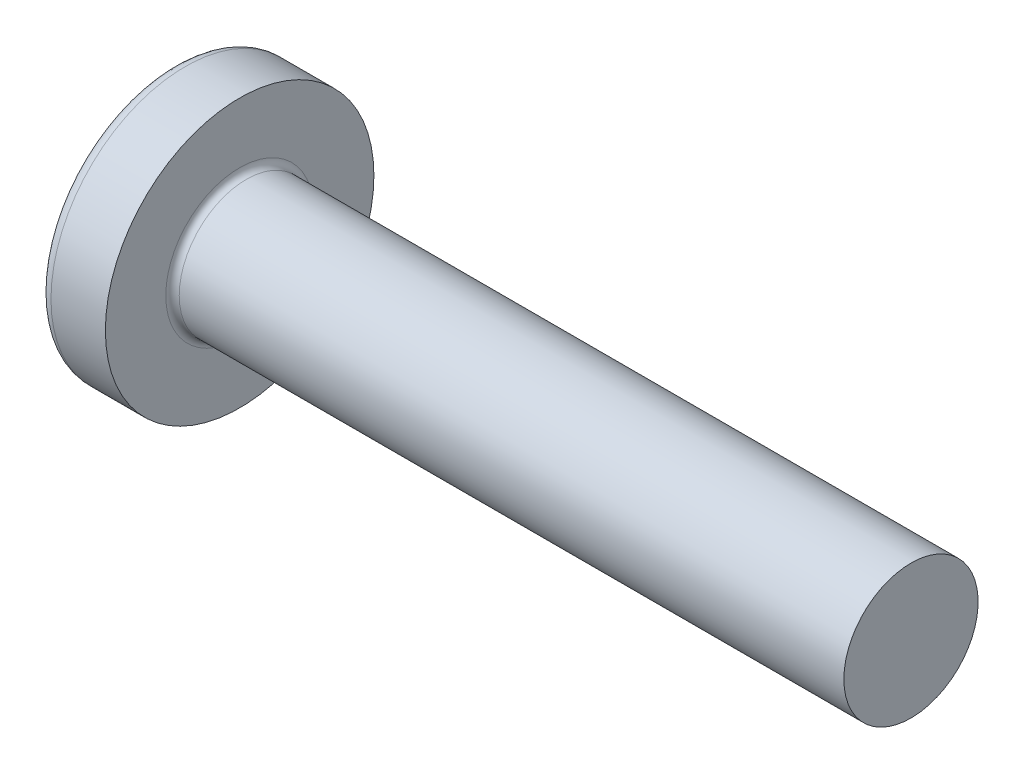
ISO-10303-21;
HEADER;
FILE_DESCRIPTION(('STEP AP214'),'2;1');
FILE_NAME('part.step','',(''),(''),'','','');
FILE_SCHEMA(('AUTOMOTIVE_DESIGN { 1 0 10303 214 1 1 1 1 }'));
ENDSEC;
DATA;
#1=APPLICATION_CONTEXT('core data for automotive mechanical design processes');
#2=APPLICATION_PROTOCOL_DEFINITION('international standard','automotive_design',2000,#1);
#3=PRODUCT_CONTEXT('',#1,'mechanical');
#4=PRODUCT('Part','Part','',(#3));
#5=PRODUCT_RELATED_PRODUCT_CATEGORY('part','',(#4));
#6=PRODUCT_DEFINITION_FORMATION('','',#4);
#7=PRODUCT_DEFINITION_CONTEXT('part definition',#1,'design');
#8=PRODUCT_DEFINITION('design','',#6,#7);
#9=PRODUCT_DEFINITION_SHAPE('','',#8);
#10=(LENGTH_UNIT() NAMED_UNIT(*) SI_UNIT(.MILLI.,.METRE.));
#11=(NAMED_UNIT(*) PLANE_ANGLE_UNIT() SI_UNIT($,.RADIAN.));
#12=(NAMED_UNIT(*) SI_UNIT($,.STERADIAN.) SOLID_ANGLE_UNIT());
#13=UNCERTAINTY_MEASURE_WITH_UNIT(LENGTH_MEASURE(1.E-05),#10,'distance_accuracy_value','');
#14=(GEOMETRIC_REPRESENTATION_CONTEXT(3) GLOBAL_UNCERTAINTY_ASSIGNED_CONTEXT((#13)) GLOBAL_UNIT_ASSIGNED_CONTEXT((#10,
#11,#12)) REPRESENTATION_CONTEXT('',''));
#15=CARTESIAN_POINT('',(0.,0.,0.));
#16=DIRECTION('',(0.,0.,1.));
#17=DIRECTION('',(1.,0.,0.));
#18=AXIS2_PLACEMENT_3D('',#15,#16,#17);
#19=CARTESIAN_POINT('',(3.2,0.,0.));
#20=DIRECTION('',(-1.,0.,0.));
#21=DIRECTION('',(0.,1.,0.));
#22=AXIS2_PLACEMENT_3D('',#19,#20,#21);
#23=SPHERICAL_SURFACE('',#22,3.2);
#24=CARTESIAN_POINT('',(0.646379599446113,0.,0.));
#25=DIRECTION('',(-1.,0.,0.));
#26=DIRECTION('',(0.,0.,1.));
#27=AXIS2_PLACEMENT_3D('',#24,#25,#26);
#28=CIRCLE('',#27,1.92847682119205);
#29=CARTESIAN_POINT('',(0.646379599446113,0.,1.92847682119205));
#30=VERTEX_POINT('',#29);
#31=EDGE_CURVE('E236',#30,#30,#28,.T.);
#32=ORIENTED_EDGE('',*,*,#31,.T.);
#33=EDGE_LOOP('',(#32));
#34=FACE_BOUND('',#33,.T.);
#35=CARTESIAN_POINT('',(0.0321614467928854,0.,0.));
#36=DIRECTION('',(1.,0.,0.));
#37=DIRECTION('',(0.,0.,-1.));
#38=AXIS2_PLACEMENT_3D('',#35,#36,#37);
#39=CIRCLE('',#38,0.452547125518057);
#40=CARTESIAN_POINT('',(0.0321614467928857,-0.239999999999998,-0.38366508938742));
#41=VERTEX_POINT('',#40);
#42=CARTESIAN_POINT('',(0.0321614467928854,-0.383665089387418,-0.24));
#43=VERTEX_POINT('',#42);
#44=EDGE_CURVE('E372',#41,#43,#39,.F.);
#45=ORIENTED_EDGE('',*,*,#44,.F.);
#46=CARTESIAN_POINT('',(3.2,-0.24,0.));
#47=DIRECTION('',(0.,1.,0.));
#48=DIRECTION('',(0.,0.,1.));
#49=AXIS2_PLACEMENT_3D('',#46,#47,#48);
#50=CIRCLE('',#49,3.19098730802866);
#51=CARTESIAN_POINT('',(0.160076670449441,-0.239999999999996,-0.970188718989376));
#52=VERTEX_POINT('',#51);
#53=EDGE_CURVE('E298',#52,#41,#50,.T.);
#54=ORIENTED_EDGE('',*,*,#53,.F.);
#55=CARTESIAN_POINT('',(2.98218770632418,0.,0.436863890831904));
#56=DIRECTION('',(0.446197800778958,0.,-0.89493436774996));
#57=DIRECTION('',(-0.89493436774996,0.,-0.446197800778958));
#58=AXIS2_PLACEMENT_3D('',#55,#56,#57);
#59=CIRCLE('',#58,3.16254766693103);
#60=CARTESIAN_POINT('',(0.160076670449441,0.240000000000003,-0.970188718989374));
#61=VERTEX_POINT('',#60);
#62=EDGE_CURVE('E270',#52,#61,#59,.T.);
#63=ORIENTED_EDGE('',*,*,#62,.T.);
#64=CARTESIAN_POINT('',(3.2,0.24,0.));
#65=DIRECTION('',(0.,-1.,0.));
#66=DIRECTION('',(0.,0.,-1.));
#67=AXIS2_PLACEMENT_3D('',#64,#65,#66);
#68=CIRCLE('',#67,3.19098730802866);
#69=CARTESIAN_POINT('',(0.0321614467928856,0.240000000000001,-0.383665089387418));
#70=VERTEX_POINT('',#69);
#71=EDGE_CURVE('E325',#70,#61,#68,.T.);
#72=ORIENTED_EDGE('',*,*,#71,.F.);
#73=CARTESIAN_POINT('',(0.0321614467928854,0.383665089387417,-0.24));
#74=VERTEX_POINT('',#73);
#75=EDGE_CURVE('E391',#74,#70,#39,.F.);
#76=ORIENTED_EDGE('',*,*,#75,.F.);
#77=CARTESIAN_POINT('',(3.2,0.,-0.24));
#78=DIRECTION('',(0.,0.,1.));
#79=DIRECTION('',(0.,-1.,0.));
#80=AXIS2_PLACEMENT_3D('',#77,#78,#79);
#81=CIRCLE('',#80,3.19098730802866);
#82=CARTESIAN_POINT('',(0.160076670449441,0.970188718989374,-0.24));
#83=VERTEX_POINT('',#82);
#84=EDGE_CURVE('E264',#83,#74,#81,.T.);
#85=ORIENTED_EDGE('',*,*,#84,.F.);
#86=CARTESIAN_POINT('',(2.98218770632418,-0.436863890831905,0.));
#87=DIRECTION('',(0.446197800778958,0.89493436774996,0.));
#88=DIRECTION('',(-0.89493436774996,0.446197800778958,0.));
#89=AXIS2_PLACEMENT_3D('',#86,#87,#88);
#90=CIRCLE('',#89,3.16254766693103);
#91=CARTESIAN_POINT('',(0.160076670449441,0.970188718989374,0.24));
#92=VERTEX_POINT('',#91);
#93=EDGE_CURVE('E267',#83,#92,#90,.T.);
#94=ORIENTED_EDGE('',*,*,#93,.T.);
#95=CARTESIAN_POINT('',(3.2,0.,0.24));
#96=DIRECTION('',(0.,0.,-1.));
#97=DIRECTION('',(-1.,0.,0.));
#98=AXIS2_PLACEMENT_3D('',#95,#96,#97);
#99=CIRCLE('',#98,3.19098730802866);
#100=CARTESIAN_POINT('',(0.0321614467928854,0.383665089387417,0.24));
#101=VERTEX_POINT('',#100);
#102=EDGE_CURVE('E260',#101,#92,#99,.T.);
#103=ORIENTED_EDGE('',*,*,#102,.F.);
#104=CARTESIAN_POINT('',(0.0321614467928857,0.239999999999999,0.38366508938742));
#105=VERTEX_POINT('',#104);
#106=EDGE_CURVE('E425',#105,#101,#39,.F.);
#107=ORIENTED_EDGE('',*,*,#106,.F.);
#108=CARTESIAN_POINT('',(0.160076670449441,0.239999999999997,0.970188718989375));
#109=VERTEX_POINT('',#108);
#110=EDGE_CURVE('E280',#109,#105,#68,.T.);
#111=ORIENTED_EDGE('',*,*,#110,.F.);
#112=CARTESIAN_POINT('',(2.98218770632418,0.,-0.436863890831904));
#113=DIRECTION('',(0.446197800778958,0.,0.89493436774996));
#114=DIRECTION('',(0.89493436774996,0.,-0.446197800778958));
#115=AXIS2_PLACEMENT_3D('',#112,#113,#114);
#116=CIRCLE('',#115,3.16254766693103);
#117=CARTESIAN_POINT('',(0.160076670449441,-0.240000000000004,0.970188718989374));
#118=VERTEX_POINT('',#117);
#119=EDGE_CURVE('E47',#109,#118,#116,.T.);
#120=ORIENTED_EDGE('',*,*,#119,.T.);
#121=CARTESIAN_POINT('',(0.0321614467928856,-0.240000000000001,0.383665089387418));
#122=VERTEX_POINT('',#121);
#123=EDGE_CURVE('E277',#122,#118,#50,.T.);
#124=ORIENTED_EDGE('',*,*,#123,.F.);
#125=CARTESIAN_POINT('',(0.0321614467928854,-0.383665089387418,0.24));
#126=VERTEX_POINT('',#125);
#127=EDGE_CURVE('E390',#126,#122,#39,.F.);
#128=ORIENTED_EDGE('',*,*,#127,.F.);
#129=CARTESIAN_POINT('',(0.160076670449441,-0.970188718989375,0.24));
#130=VERTEX_POINT('',#129);
#131=EDGE_CURVE('E261',#130,#126,#99,.T.);
#132=ORIENTED_EDGE('',*,*,#131,.F.);
#133=CARTESIAN_POINT('',(2.98218770632418,0.436863890831904,0.));
#134=DIRECTION('',(0.446197800778958,-0.89493436774996,0.));
#135=DIRECTION('',(0.89493436774996,0.446197800778958,0.));
#136=AXIS2_PLACEMENT_3D('',#133,#134,#135);
#137=CIRCLE('',#136,3.16254766693103);
#138=CARTESIAN_POINT('',(0.160076670449441,-0.970188718989375,-0.24));
#139=VERTEX_POINT('',#138);
#140=EDGE_CURVE('E257',#130,#139,#137,.T.);
#141=ORIENTED_EDGE('',*,*,#140,.T.);
#142=EDGE_CURVE('E62',#43,#139,#81,.T.);
#143=ORIENTED_EDGE('',*,*,#142,.F.);
#144=EDGE_LOOP('',(#45,#54,#63,#72,#76,#85,#94,#103,#107,#111,#120,#124,#128,#132,#141,#143));
#145=FACE_BOUND('',#144,.T.);
#146=ADVANCED_FACE('F34',(#34,#145),#23,.T.);
#147=CARTESIAN_POINT('',(1.42,0.342014140993248,-0.24));
#148=DIRECTION('',(0.,0.,1.));
#149=DIRECTION('',(0.,-1.,0.));
#150=AXIS2_PLACEMENT_3D('',#147,#148,#149);
#151=PLANE('',#150);
#152=ORIENTED_EDGE('',*,*,#84,.T.);
#153=CARTESIAN_POINT('',(-0.626811087646333,0.437068483432734,-0.24));
#154=CARTESIAN_POINT('',(-0.489788496188268,0.426133650699674,-0.24));
#155=CARTESIAN_POINT('',(-0.35277275089666,0.415111501640761,-0.24));
#156=CARTESIAN_POINT('',(-0.0787578829644779,0.392826208775377,-0.24));
#157=CARTESIAN_POINT('',(0.0582412392502162,0.381563059737591,-0.24));
#158=CARTESIAN_POINT('',(0.332213907654152,0.358729879929546,-0.24));
#159=CARTESIAN_POINT('',(0.469187453856034,0.347159849311357,-0.24));
#160=CARTESIAN_POINT('',(0.743097225439297,0.323608060039765,-0.24));
#161=CARTESIAN_POINT('',(0.880033451350377,0.311626307573655,-0.24));
#162=CARTESIAN_POINT('',(1.12503843743479,0.289667437089413,-0.24));
#163=CARTESIAN_POINT('',(1.23311691792,0.279799173776849,-0.24));
#164=CARTESIAN_POINT('',(1.4492267018282,0.259570129968442,-0.24));
#165=CARTESIAN_POINT('',(1.55725800577256,0.249209355061897,-0.24));
#166=CARTESIAN_POINT('',(1.77325939831777,0.227783788850472,-0.24));
#167=CARTESIAN_POINT('',(1.88122948205844,0.216718947894399,-0.24));
#168=CARTESIAN_POINT('',(2.04309848476113,0.199296215271932,-0.24));
#169=CARTESIAN_POINT('',(2.09704158415864,0.193350927204475,-0.24));
#170=CARTESIAN_POINT('',(2.20488609252136,0.181086542764125,-0.24));
#171=CARTESIAN_POINT('',(2.25878750075649,0.174767439988846,-0.24));
#172=CARTESIAN_POINT('',(2.31266102213859,0.168212174791089,-0.24));
#173=B_SPLINE_CURVE_WITH_KNOTS('',3,(#153,#154,#155,#156,#157,#158,#159,#160,#161,#162,#163,
#164,#165,#166,#167,#168,#169,#170,#171,#172),.UNSPECIFIED.,.F.,.F.,(4,2,2,2,2,2,2,2,2,4),(0.,
0.412374804430943,0.824758569256476,1.23714212973639,1.64951949568622,1.97510284899868,
2.30068250829037,2.62628515317116,2.78909323564388,2.95190410736571),.UNSPECIFIED.);
#174=CARTESIAN_POINT('',(1.42,0.262259890185289,-0.240000000000001));
#175=VERTEX_POINT('',#174);
#176=EDGE_CURVE('E412',#74,#175,#173,.T.);
#177=ORIENTED_EDGE('',*,*,#176,.T.);
#178=DIRECTION('',(0.,1.,0.));
#179=VECTOR('',#178,1.);
#180=CARTESIAN_POINT('',(1.42,-0.342014140993248,-0.24));
#181=LINE('',#180,#179);
#182=CARTESIAN_POINT('',(1.42,0.342014140993248,-0.24));
#183=VERTEX_POINT('',#182);
#184=EDGE_CURVE('E354',#175,#183,#181,.T.);
#185=ORIENTED_EDGE('',*,*,#184,.T.);
#186=DIRECTION('',(0.89493436774996,-0.446197800778958,0.));
#187=VECTOR('',#186,1.);
#188=CARTESIAN_POINT('',(0.,1.05,-0.24));
#189=LINE('',#188,#187);
#190=EDGE_CURVE('E237',#83,#183,#189,.T.);
#191=ORIENTED_EDGE('',*,*,#190,.F.);
#192=EDGE_LOOP('',(#152,#177,#185,#191));
#193=FACE_BOUND('',#192,.T.);
#194=ADVANCED_FACE('F192',(#193),#151,.T.);
#195=CARTESIAN_POINT('',(1.42,-0.342014140993248,-0.24));
#196=VERTEX_POINT('',#195);
#197=CARTESIAN_POINT('',(1.42,-0.262259890185289,-0.240000000000001));
#198=VERTEX_POINT('',#197);
#199=EDGE_CURVE('E245',#196,#198,#181,.T.);
#200=ORIENTED_EDGE('',*,*,#199,.T.);
#201=CARTESIAN_POINT('',(-0.626811087646333,-0.437068483432734,-0.24));
#202=CARTESIAN_POINT('',(-0.489788496188267,-0.426133650699674,-0.24));
#203=CARTESIAN_POINT('',(-0.35277275089666,-0.415111501640761,-0.24));
#204=CARTESIAN_POINT('',(-0.0787578829644778,-0.392826208775377,-0.24));
#205=CARTESIAN_POINT('',(0.0582412392502162,-0.381563059737591,-0.24));
#206=CARTESIAN_POINT('',(0.332213907654153,-0.358729879929546,-0.24));
#207=CARTESIAN_POINT('',(0.469187453856035,-0.347159849311357,-0.24));
#208=CARTESIAN_POINT('',(0.743097225439297,-0.323608060039765,-0.24));
#209=CARTESIAN_POINT('',(0.880033451350377,-0.311626307573655,-0.24));
#210=CARTESIAN_POINT('',(1.12503843743479,-0.289667437089413,-0.24));
#211=CARTESIAN_POINT('',(1.23311691792,-0.279799173776849,-0.24));
#212=CARTESIAN_POINT('',(1.4492267018282,-0.259570129968442,-0.24));
#213=CARTESIAN_POINT('',(1.55725800577256,-0.249209355061897,-0.24));
#214=CARTESIAN_POINT('',(1.77325939831777,-0.227783788850472,-0.24));
#215=CARTESIAN_POINT('',(1.88122948205844,-0.216718947894399,-0.24));
#216=CARTESIAN_POINT('',(2.04309848476113,-0.199296215271932,-0.24));
#217=CARTESIAN_POINT('',(2.09704158415864,-0.193350927204474,-0.24));
#218=CARTESIAN_POINT('',(2.20488609252136,-0.181086542764125,-0.24));
#219=CARTESIAN_POINT('',(2.25878750075649,-0.174767439988846,-0.24));
#220=CARTESIAN_POINT('',(2.31266102213859,-0.168212174791089,-0.24));
#221=B_SPLINE_CURVE_WITH_KNOTS('',3,(#201,#202,#203,#204,#205,#206,#207,#208,#209,#210,#211,
#212,#213,#214,#215,#216,#217,#218,#219,#220),.UNSPECIFIED.,.F.,.F.,(4,2,2,2,2,2,2,2,2,4),(0.,
0.412374804430943,0.824758569256476,1.23714212973639,1.64951949568622,1.97510284899868,
2.30068250829037,2.62628515317116,2.78909323564388,2.95190410736571),.UNSPECIFIED.);
#222=EDGE_CURVE('E389',#198,#43,#221,.F.);
#223=ORIENTED_EDGE('',*,*,#222,.T.);
#224=ORIENTED_EDGE('',*,*,#142,.T.);
#225=DIRECTION('',(0.89493436774996,0.446197800778958,0.));
#226=VECTOR('',#225,1.);
#227=CARTESIAN_POINT('',(0.,-1.05,-0.24));
#228=LINE('',#227,#226);
#229=EDGE_CURVE('E328',#139,#196,#228,.T.);
#230=ORIENTED_EDGE('',*,*,#229,.T.);
#231=EDGE_LOOP('',(#200,#223,#224,#230));
#232=FACE_BOUND('',#231,.T.);
#233=ADVANCED_FACE('F198',(#232),#151,.T.);
#234=CARTESIAN_POINT('',(1.42,-0.342014140993248,0.24));
#235=DIRECTION('',(0.,0.,-1.));
#236=DIRECTION('',(-1.,0.,0.));
#237=AXIS2_PLACEMENT_3D('',#234,#235,#236);
#238=PLANE('',#237);
#239=DIRECTION('',(0.,-1.,0.));
#240=VECTOR('',#239,1.);
#241=CARTESIAN_POINT('',(1.42,0.342014140993248,0.24));
#242=LINE('',#241,#240);
#243=CARTESIAN_POINT('',(1.42,0.342014140993248,0.24));
#244=VERTEX_POINT('',#243);
#245=CARTESIAN_POINT('',(1.42,0.262259890185289,0.240000000000001));
#246=VERTEX_POINT('',#245);
#247=EDGE_CURVE('E337',#244,#246,#242,.T.);
#248=ORIENTED_EDGE('',*,*,#247,.T.);
#249=CARTESIAN_POINT('',(-0.62681108769363,0.437068483436507,0.24));
#250=CARTESIAN_POINT('',(-0.489788496230297,0.426133650703048,0.24));
#251=CARTESIAN_POINT('',(-0.352772750933422,0.415111501643733,0.24));
#252=CARTESIAN_POINT('',(-0.0787578829907055,0.392826208777529,0.24));
#253=CARTESIAN_POINT('',(0.0582412392292552,0.381563059739326,0.24));
#254=CARTESIAN_POINT('',(0.332213907649304,0.358729879929962,0.24));
#255=CARTESIAN_POINT('',(0.46918745386203,0.347159849310859,0.24));
#256=CARTESIAN_POINT('',(0.743097225466975,0.323608060037368,0.24));
#257=CARTESIAN_POINT('',(0.880033451388893,0.311626307570274,0.24));
#258=CARTESIAN_POINT('',(1.12503843748414,0.289667437084935,0.24));
#259=CARTESIAN_POINT('',(1.23311691796934,0.279799173772307,0.24));
#260=CARTESIAN_POINT('',(1.44922670187753,0.259570129963748,0.24));
#261=CARTESIAN_POINT('',(1.55725800582188,0.249209355057115,0.24));
#262=CARTESIAN_POINT('',(1.77325939836707,0.227783788845471,0.24));
#263=CARTESIAN_POINT('',(1.88122948210773,0.216718947889267,0.24));
#264=CARTESIAN_POINT('',(2.0430984848104,0.199296215266543,0.24));
#265=CARTESIAN_POINT('',(2.0970415842079,0.193350927198989,0.24));
#266=CARTESIAN_POINT('',(2.20488609257059,0.181086542758414,0.24));
#267=CARTESIAN_POINT('',(2.25878750080571,0.174767439983005,0.24));
#268=CARTESIAN_POINT('',(2.31266102218779,0.168212174785095,0.24));
#269=B_SPLINE_CURVE_WITH_KNOTS('',3,(#249,#250,#251,#252,#253,#254,#255,#256,#257,#258,#259,
#260,#261,#262,#263,#264,#265,#266,#267,#268),.UNSPECIFIED.,.F.,.F.,(4,2,2,2,2,2,2,2,2,4),(0.,
0.412374804446791,0.824758569288173,1.23714212980074,1.64951949578321,1.97510284909568,
2.30068250838737,2.62628515326816,2.78909323574089,2.95190410746272),.UNSPECIFIED.);
#270=EDGE_CURVE('E426',#246,#101,#269,.F.);
#271=ORIENTED_EDGE('',*,*,#270,.T.);
#272=ORIENTED_EDGE('',*,*,#102,.T.);
#273=DIRECTION('',(0.89493436774996,-0.446197800778958,0.));
#274=VECTOR('',#273,1.);
#275=CARTESIAN_POINT('',(0.,1.05,0.24));
#276=LINE('',#275,#274);
#277=EDGE_CURVE('E242',#92,#244,#276,.T.);
#278=ORIENTED_EDGE('',*,*,#277,.T.);
#279=EDGE_LOOP('',(#248,#271,#272,#278));
#280=FACE_BOUND('',#279,.T.);
#281=ADVANCED_FACE('F408',(#280),#238,.T.);
#282=ORIENTED_EDGE('',*,*,#131,.T.);
#283=CARTESIAN_POINT('',(-0.62681108769363,-0.437068483436507,0.24));
#284=CARTESIAN_POINT('',(-0.489788496230297,-0.426133650703048,0.24));
#285=CARTESIAN_POINT('',(-0.352772750933422,-0.415111501643733,0.24));
#286=CARTESIAN_POINT('',(-0.0787578829907056,-0.392826208777529,0.24));
#287=CARTESIAN_POINT('',(0.0582412392292552,-0.381563059739326,0.24));
#288=CARTESIAN_POINT('',(0.332213907649304,-0.358729879929962,0.24));
#289=CARTESIAN_POINT('',(0.46918745386203,-0.347159849310859,0.24));
#290=CARTESIAN_POINT('',(0.743097225466975,-0.323608060037368,0.24));
#291=CARTESIAN_POINT('',(0.880033451388893,-0.311626307570274,0.24));
#292=CARTESIAN_POINT('',(1.12503843748414,-0.289667437084935,0.24));
#293=CARTESIAN_POINT('',(1.23311691796934,-0.279799173772307,0.24));
#294=CARTESIAN_POINT('',(1.44922670187753,-0.259570129963748,0.24));
#295=CARTESIAN_POINT('',(1.55725800582188,-0.249209355057115,0.24));
#296=CARTESIAN_POINT('',(1.77325939836707,-0.227783788845471,0.24));
#297=CARTESIAN_POINT('',(1.88122948210773,-0.216718947889267,0.24));
#298=CARTESIAN_POINT('',(2.0430984848104,-0.199296215266543,0.24));
#299=CARTESIAN_POINT('',(2.0970415842079,-0.193350927198989,0.24));
#300=CARTESIAN_POINT('',(2.20488609257059,-0.181086542758414,0.24));
#301=CARTESIAN_POINT('',(2.25878750080571,-0.174767439983005,0.24));
#302=CARTESIAN_POINT('',(2.31266102218779,-0.168212174785095,0.24));
#303=B_SPLINE_CURVE_WITH_KNOTS('',3,(#283,#284,#285,#286,#287,#288,#289,#290,#291,#292,#293,
#294,#295,#296,#297,#298,#299,#300,#301,#302),.UNSPECIFIED.,.F.,.F.,(4,2,2,2,2,2,2,2,2,4),(0.,
0.412374804446791,0.824758569288173,1.23714212980074,1.64951949578321,1.97510284909568,
2.30068250838736,2.62628515326816,2.78909323574088,2.95190410746272),.UNSPECIFIED.);
#304=CARTESIAN_POINT('',(1.42,-0.262259890185289,0.240000000000001));
#305=VERTEX_POINT('',#304);
#306=EDGE_CURVE('E445',#126,#305,#303,.T.);
#307=ORIENTED_EDGE('',*,*,#306,.T.);
#308=CARTESIAN_POINT('',(1.42,-0.342014140993248,0.24));
#309=VERTEX_POINT('',#308);
#310=EDGE_CURVE('E339',#305,#309,#242,.T.);
#311=ORIENTED_EDGE('',*,*,#310,.T.);
#312=DIRECTION('',(0.89493436774996,0.446197800778958,0.));
#313=VECTOR('',#312,1.);
#314=CARTESIAN_POINT('',(0.,-1.05,0.24));
#315=LINE('',#314,#313);
#316=EDGE_CURVE('E330',#130,#309,#315,.T.);
#317=ORIENTED_EDGE('',*,*,#316,.F.);
#318=EDGE_LOOP('',(#282,#307,#311,#317));
#319=FACE_BOUND('',#318,.T.);
#320=ADVANCED_FACE('F504',(#319),#238,.T.);
#321=CARTESIAN_POINT('',(1.42,0.342014140993248,0.24));
#322=DIRECTION('',(0.446197800778958,0.89493436774996,0.));
#323=DIRECTION('',(-0.89493436774996,0.446197800778958,0.));
#324=AXIS2_PLACEMENT_3D('',#321,#322,#323);
#325=PLANE('',#324);
#326=CARTESIAN_POINT('',(2.01772939130752,0.0439972701774458,0.));
#327=DIRECTION('',(0.446197800778958,0.89493436774996,0.));
#328=DIRECTION('',(-0.89493436774996,0.446197800778958,0.));
#329=AXIS2_PLACEMENT_3D('',#326,#327,#328);
#330=ELLIPSE('',#329,0.703057452800714,0.310602024247227);
#331=CARTESIAN_POINT('',(1.42,0.342014140993249,0.0969875113643501));
#332=VERTEX_POINT('',#331);
#333=CARTESIAN_POINT('',(1.42,0.342014140993249,-0.09698751136435));
#334=VERTEX_POINT('',#333);
#335=EDGE_CURVE('E303',#332,#334,#330,.F.);
#336=ORIENTED_EDGE('',*,*,#335,.F.);
#337=DIRECTION('',(0.,0.,-1.));
#338=VECTOR('',#337,1.);
#339=CARTESIAN_POINT('',(1.42,0.342014140993248,0.24));
#340=LINE('',#339,#338);
#341=EDGE_CURVE('E340',#244,#332,#340,.T.);
#342=ORIENTED_EDGE('',*,*,#341,.F.);
#343=ORIENTED_EDGE('',*,*,#277,.F.);
#344=ORIENTED_EDGE('',*,*,#93,.F.);
#345=ORIENTED_EDGE('',*,*,#190,.T.);
#346=EDGE_CURVE('E342',#334,#183,#340,.T.);
#347=ORIENTED_EDGE('',*,*,#346,.F.);
#348=EDGE_LOOP('',(#336,#342,#343,#344,#345,#347));
#349=FACE_BOUND('',#348,.T.);
#350=ADVANCED_FACE('F406',(#349),#325,.F.);
#351=CARTESIAN_POINT('',(1.42,-0.342014140993248,-0.24));
#352=DIRECTION('',(0.446197800778958,-0.89493436774996,0.));
#353=DIRECTION('',(0.89493436774996,0.446197800778958,0.));
#354=AXIS2_PLACEMENT_3D('',#351,#352,#353);
#355=PLANE('',#354);
#356=CARTESIAN_POINT('',(2.01772939130752,-0.0439972701774457,0.));
#357=DIRECTION('',(0.446197800778958,-0.89493436774996,0.));
#358=DIRECTION('',(-0.89493436774996,-0.446197800778958,0.));
#359=AXIS2_PLACEMENT_3D('',#356,#357,#358);
#360=ELLIPSE('',#359,0.703057452800713,0.310602024247227);
#361=CARTESIAN_POINT('',(1.42,-0.342014140993249,-0.09698751136435));
#362=VERTEX_POINT('',#361);
#363=CARTESIAN_POINT('',(1.42,-0.342014140993249,0.09698751136435));
#364=VERTEX_POINT('',#363);
#365=EDGE_CURVE('E450',#362,#364,#360,.F.);
#366=ORIENTED_EDGE('',*,*,#365,.F.);
#367=DIRECTION('',(0.,0.,1.));
#368=VECTOR('',#367,1.);
#369=CARTESIAN_POINT('',(1.42,-0.342014140993248,-0.24));
#370=LINE('',#369,#368);
#371=EDGE_CURVE('E333',#196,#362,#370,.T.);
#372=ORIENTED_EDGE('',*,*,#371,.F.);
#373=ORIENTED_EDGE('',*,*,#229,.F.);
#374=ORIENTED_EDGE('',*,*,#140,.F.);
#375=ORIENTED_EDGE('',*,*,#316,.T.);
#376=EDGE_CURVE('E336',#364,#309,#370,.T.);
#377=ORIENTED_EDGE('',*,*,#376,.F.);
#378=EDGE_LOOP('',(#366,#372,#373,#374,#375,#377));
#379=FACE_BOUND('',#378,.T.);
#380=ADVANCED_FACE('F498',(#379),#355,.F.);
#381=CARTESIAN_POINT('',(1.42,-0.342014140993248,-0.24));
#382=DIRECTION('',(1.,0.,0.));
#383=DIRECTION('',(0.,0.,-1.));
#384=AXIS2_PLACEMENT_3D('',#381,#382,#383);
#385=PLANE('',#384);
#386=CARTESIAN_POINT('',(1.42,0.,0.));
#387=DIRECTION('',(-1.,0.,0.));
#388=DIRECTION('',(0.,0.,1.));
#389=AXIS2_PLACEMENT_3D('',#386,#387,#388);
#390=CIRCLE('',#389,0.3555);
#391=CARTESIAN_POINT('',(1.42,-0.096987511364352,-0.342014140993249));
#392=VERTEX_POINT('',#391);
#393=CARTESIAN_POINT('',(1.42,-0.239999999999999,-0.262259890185289));
#394=VERTEX_POINT('',#393);
#395=EDGE_CURVE('E54',#392,#394,#390,.T.);
#396=ORIENTED_EDGE('',*,*,#395,.F.);
#397=DIRECTION('',(0.,-1.,0.));
#398=VECTOR('',#397,1.);
#399=CARTESIAN_POINT('',(1.42,0.240000000000001,-0.342014140993247));
#400=LINE('',#399,#398);
#401=CARTESIAN_POINT('',(1.42,-0.239999999999999,-0.342014140993249));
#402=VERTEX_POINT('',#401);
#403=EDGE_CURVE('E313',#392,#402,#400,.T.);
#404=ORIENTED_EDGE('',*,*,#403,.T.);
#405=DIRECTION('',(0.,0.,-1.));
#406=VECTOR('',#405,1.);
#407=CARTESIAN_POINT('',(1.42,-0.240000000000001,0.342014140993247));
#408=LINE('',#407,#406);
#409=EDGE_CURVE('E317',#394,#402,#408,.T.);
#410=ORIENTED_EDGE('',*,*,#409,.F.);
#411=EDGE_LOOP('',(#396,#404,#410));
#412=FACE_BOUND('',#411,.T.);
#413=ADVANCED_FACE('F378',(#412),#385,.F.);
#414=EDGE_CURVE('E383',#198,#362,#390,.T.);
#415=ORIENTED_EDGE('',*,*,#414,.F.);
#416=ORIENTED_EDGE('',*,*,#199,.F.);
#417=ORIENTED_EDGE('',*,*,#371,.T.);
#418=EDGE_LOOP('',(#415,#416,#417));
#419=FACE_BOUND('',#418,.T.);
#420=ADVANCED_FACE('F497',(#419),#385,.F.);
#421=EDGE_CURVE('E511',#364,#305,#390,.T.);
#422=ORIENTED_EDGE('',*,*,#421,.F.);
#423=ORIENTED_EDGE('',*,*,#376,.T.);
#424=ORIENTED_EDGE('',*,*,#310,.F.);
#425=EDGE_LOOP('',(#422,#423,#424));
#426=FACE_BOUND('',#425,.T.);
#427=ADVANCED_FACE('F495',(#426),#385,.F.);
#428=CARTESIAN_POINT('',(1.42,-0.240000000000001,0.262259890185289));
#429=VERTEX_POINT('',#428);
#430=CARTESIAN_POINT('',(1.42,-0.0969875113643545,0.342014140993248));
#431=VERTEX_POINT('',#430);
#432=EDGE_CURVE('E482',#429,#431,#390,.T.);
#433=ORIENTED_EDGE('',*,*,#432,.F.);
#434=CARTESIAN_POINT('',(1.42,-0.240000000000001,0.342014140993247));
#435=VERTEX_POINT('',#434);
#436=EDGE_CURVE('E314',#435,#429,#408,.T.);
#437=ORIENTED_EDGE('',*,*,#436,.F.);
#438=DIRECTION('',(0.,1.,0.));
#439=VECTOR('',#438,1.);
#440=CARTESIAN_POINT('',(1.42,-0.240000000000001,0.342014140993247));
#441=LINE('',#440,#439);
#442=EDGE_CURVE('E318',#435,#431,#441,.T.);
#443=ORIENTED_EDGE('',*,*,#442,.T.);
#444=EDGE_LOOP('',(#433,#437,#443));
#445=FACE_BOUND('',#444,.T.);
#446=ADVANCED_FACE('F480',(#445),#385,.F.);
#447=CARTESIAN_POINT('',(1.42,0.096987511364352,0.342014140993249));
#448=VERTEX_POINT('',#447);
#449=CARTESIAN_POINT('',(1.42,0.239999999999999,0.26225989018529));
#450=VERTEX_POINT('',#449);
#451=EDGE_CURVE('E384',#448,#450,#390,.T.);
#452=ORIENTED_EDGE('',*,*,#451,.F.);
#453=CARTESIAN_POINT('',(1.42,0.239999999999999,0.342014140993249));
#454=VERTEX_POINT('',#453);
#455=EDGE_CURVE('E321',#448,#454,#441,.T.);
#456=ORIENTED_EDGE('',*,*,#455,.T.);
#457=DIRECTION('',(0.,0.,1.));
#458=VECTOR('',#457,1.);
#459=CARTESIAN_POINT('',(1.42,0.240000000000001,-0.342014140993247));
#460=LINE('',#459,#458);
#461=EDGE_CURVE('E295',#450,#454,#460,.T.);
#462=ORIENTED_EDGE('',*,*,#461,.F.);
#463=EDGE_LOOP('',(#452,#456,#462));
#464=FACE_BOUND('',#463,.T.);
#465=ADVANCED_FACE('F488',(#464),#385,.F.);
#466=EDGE_CURVE('E464',#246,#332,#390,.T.);
#467=ORIENTED_EDGE('',*,*,#466,.F.);
#468=ORIENTED_EDGE('',*,*,#247,.F.);
#469=ORIENTED_EDGE('',*,*,#341,.T.);
#470=EDGE_LOOP('',(#467,#468,#469));
#471=FACE_BOUND('',#470,.T.);
#472=ADVANCED_FACE('F490',(#471),#385,.F.);
#473=EDGE_CURVE('E462',#334,#175,#390,.T.);
#474=ORIENTED_EDGE('',*,*,#473,.F.);
#475=ORIENTED_EDGE('',*,*,#346,.T.);
#476=ORIENTED_EDGE('',*,*,#184,.F.);
#477=EDGE_LOOP('',(#474,#475,#476));
#478=FACE_BOUND('',#477,.T.);
#479=ADVANCED_FACE('F465',(#478),#385,.F.);
#480=CARTESIAN_POINT('',(1.42,0.240000000000001,-0.262259890185289));
#481=VERTEX_POINT('',#480);
#482=CARTESIAN_POINT('',(1.42,0.0969875113643544,-0.342014140993248));
#483=VERTEX_POINT('',#482);
#484=EDGE_CURVE('E382',#481,#483,#390,.T.);
#485=ORIENTED_EDGE('',*,*,#484,.F.);
#486=CARTESIAN_POINT('',(1.42,0.240000000000001,-0.342014140993247));
#487=VERTEX_POINT('',#486);
#488=EDGE_CURVE('E322',#487,#481,#460,.T.);
#489=ORIENTED_EDGE('',*,*,#488,.F.);
#490=EDGE_CURVE('E310',#487,#483,#400,.T.);
#491=ORIENTED_EDGE('',*,*,#490,.T.);
#492=EDGE_LOOP('',(#485,#489,#491));
#493=FACE_BOUND('',#492,.T.);
#494=ADVANCED_FACE('F436',(#493),#385,.F.);
#495=CARTESIAN_POINT('',(1.42,-0.239999999999999,-0.342014140993249));
#496=DIRECTION('',(0.,1.,0.));
#497=DIRECTION('',(-1.,0.,0.));
#498=AXIS2_PLACEMENT_3D('',#495,#496,#497);
#499=PLANE('',#498);
#500=ORIENTED_EDGE('',*,*,#436,.T.);
#501=CARTESIAN_POINT('',(-0.62681108769363,-0.240000000000001,0.437068483436506));
#502=CARTESIAN_POINT('',(-0.489788496230297,-0.240000000000001,0.426133650703047));
#503=CARTESIAN_POINT('',(-0.352772750933422,-0.240000000000001,0.415111501643732));
#504=CARTESIAN_POINT('',(-0.0787578829907056,-0.240000000000001,0.392826208777528));
#505=CARTESIAN_POINT('',(0.0582412392292551,-0.240000000000001,0.381563059739325));
#506=CARTESIAN_POINT('',(0.332213907649304,-0.240000000000001,0.358729879929961));
#507=CARTESIAN_POINT('',(0.46918745386203,-0.240000000000001,0.347159849310858));
#508=CARTESIAN_POINT('',(0.743097225466975,-0.240000000000001,0.323608060037367));
#509=CARTESIAN_POINT('',(0.880033451388893,-0.240000000000001,0.311626307570273));
#510=CARTESIAN_POINT('',(1.12503843748414,-0.240000000000001,0.289667437084934));
#511=CARTESIAN_POINT('',(1.23311691796933,-0.240000000000001,0.279799173772306));
#512=CARTESIAN_POINT('',(1.44922670187753,-0.240000000000001,0.259570129963747));
#513=CARTESIAN_POINT('',(1.55725800582188,-0.240000000000001,0.249209355057114));
#514=CARTESIAN_POINT('',(1.77325939836707,-0.240000000000001,0.227783788845471));
#515=CARTESIAN_POINT('',(1.88122948210773,-0.240000000000001,0.216718947889266));
#516=CARTESIAN_POINT('',(2.0430984848104,-0.240000000000001,0.199296215266542));
#517=CARTESIAN_POINT('',(2.0970415842079,-0.240000000000001,0.193350927198988));
#518=CARTESIAN_POINT('',(2.20488609257059,-0.240000000000001,0.181086542758413));
#519=CARTESIAN_POINT('',(2.25878750080571,-0.240000000000001,0.174767439983004));
#520=CARTESIAN_POINT('',(2.31266102218779,-0.240000000000001,0.168212174785094));
#521=B_SPLINE_CURVE_WITH_KNOTS('',3,(#501,#502,#503,#504,#505,#506,#507,#508,#509,#510,#511,
#512,#513,#514,#515,#516,#517,#518,#519,#520),.UNSPECIFIED.,.F.,.F.,(4,2,2,2,2,2,2,2,2,4),(0.,
0.412374804446791,0.824758569288173,1.23714212980074,1.64951949578321,1.97510284909568,
2.30068250838736,2.62628515326816,2.78909323574088,2.95190410746272),.UNSPECIFIED.);
#522=EDGE_CURVE('E439',#429,#122,#521,.F.);
#523=ORIENTED_EDGE('',*,*,#522,.T.);
#524=ORIENTED_EDGE('',*,*,#123,.T.);
#525=DIRECTION('',(0.89493436774996,0.,-0.446197800778958));
#526=VECTOR('',#525,1.);
#527=CARTESIAN_POINT('',(0.,-0.240000000000004,1.05));
#528=LINE('',#527,#526);
#529=EDGE_CURVE('E290',#118,#435,#528,.T.);
#530=ORIENTED_EDGE('',*,*,#529,.T.);
#531=EDGE_LOOP('',(#500,#523,#524,#530));
#532=FACE_BOUND('',#531,.T.);
#533=ADVANCED_FACE('F227',(#532),#499,.T.);
#534=CARTESIAN_POINT('',(1.42,0.239999999999999,0.342014140993249));
#535=DIRECTION('',(0.,-1.,0.));
#536=DIRECTION('',(0.,0.,-1.));
#537=AXIS2_PLACEMENT_3D('',#534,#535,#536);
#538=PLANE('',#537);
#539=ORIENTED_EDGE('',*,*,#110,.T.);
#540=CARTESIAN_POINT('',(-0.62681108769363,0.239999999999998,0.437068483436508));
#541=CARTESIAN_POINT('',(-0.489788496230297,0.239999999999998,0.426133650703049));
#542=CARTESIAN_POINT('',(-0.352772750933422,0.239999999999998,0.415111501643734));
#543=CARTESIAN_POINT('',(-0.0787578829907056,0.239999999999999,0.39282620877753));
#544=CARTESIAN_POINT('',(0.0582412392292552,0.239999999999999,0.381563059739327));
#545=CARTESIAN_POINT('',(0.332213907649304,0.239999999999999,0.358729879929963));
#546=CARTESIAN_POINT('',(0.46918745386203,0.239999999999999,0.34715984931086));
#547=CARTESIAN_POINT('',(0.743097225466975,0.239999999999999,0.323608060037369));
#548=CARTESIAN_POINT('',(0.880033451388893,0.239999999999999,0.311626307570275));
#549=CARTESIAN_POINT('',(1.12503843748414,0.239999999999999,0.289667437084936));
#550=CARTESIAN_POINT('',(1.23311691796934,0.239999999999999,0.279799173772307));
#551=CARTESIAN_POINT('',(1.44922670187753,0.239999999999999,0.259570129963749));
#552=CARTESIAN_POINT('',(1.55725800582188,0.239999999999999,0.249209355057116));
#553=CARTESIAN_POINT('',(1.77325939836707,0.239999999999999,0.227783788845472));
#554=CARTESIAN_POINT('',(1.88122948210773,0.239999999999999,0.216718947889268));
#555=CARTESIAN_POINT('',(2.0430984848104,0.239999999999999,0.199296215266544));
#556=CARTESIAN_POINT('',(2.0970415842079,0.239999999999999,0.19335092719899));
#557=CARTESIAN_POINT('',(2.20488609257059,0.239999999999999,0.181086542758415));
#558=CARTESIAN_POINT('',(2.25878750080571,0.239999999999999,0.174767439983006));
#559=CARTESIAN_POINT('',(2.31266102218779,0.239999999999999,0.168212174785096));
#560=B_SPLINE_CURVE_WITH_KNOTS('',3,(#540,#541,#542,#543,#544,#545,#546,#547,#548,#549,#550,
#551,#552,#553,#554,#555,#556,#557,#558,#559),.UNSPECIFIED.,.F.,.F.,(4,2,2,2,2,2,2,2,2,4),(0.,
0.412374804446791,0.824758569288173,1.23714212980074,1.64951949578321,1.97510284909568,
2.30068250838736,2.62628515326816,2.78909323574088,2.95190410746272),.UNSPECIFIED.);
#561=EDGE_CURVE('E420',#105,#450,#560,.T.);
#562=ORIENTED_EDGE('',*,*,#561,.T.);
#563=ORIENTED_EDGE('',*,*,#461,.T.);
#564=DIRECTION('',(0.89493436774996,0.,-0.446197800778958));
#565=VECTOR('',#564,1.);
#566=CARTESIAN_POINT('',(0.,0.239999999999996,1.05));
#567=LINE('',#566,#565);
#568=EDGE_CURVE('E288',#109,#454,#567,.T.);
#569=ORIENTED_EDGE('',*,*,#568,.F.);
#570=EDGE_LOOP('',(#539,#562,#563,#569));
#571=FACE_BOUND('',#570,.T.);
#572=ADVANCED_FACE('F292',(#571),#538,.T.);
#573=CARTESIAN_POINT('',(1.42,-0.240000000000001,0.342014140993247));
#574=DIRECTION('',(0.446197800778958,0.,0.89493436774996));
#575=DIRECTION('',(-0.89493436774996,0.,0.446197800778958));
#576=AXIS2_PLACEMENT_3D('',#573,#574,#575);
#577=PLANE('',#576);
#578=CARTESIAN_POINT('',(2.01772939130752,0.,0.0439972701774457));
#579=DIRECTION('',(0.446197800778958,0.,0.89493436774996));
#580=DIRECTION('',(-0.89493436774996,0.,0.446197800778958));
#581=AXIS2_PLACEMENT_3D('',#578,#579,#580);
#582=ELLIPSE('',#581,0.703057452800713,0.310602024247227);
#583=EDGE_CURVE('E418',#431,#448,#582,.F.);
#584=ORIENTED_EDGE('',*,*,#583,.F.);
#585=ORIENTED_EDGE('',*,*,#442,.F.);
#586=ORIENTED_EDGE('',*,*,#529,.F.);
#587=ORIENTED_EDGE('',*,*,#119,.F.);
#588=ORIENTED_EDGE('',*,*,#568,.T.);
#589=ORIENTED_EDGE('',*,*,#455,.F.);
#590=EDGE_LOOP('',(#584,#585,#586,#587,#588,#589));
#591=FACE_BOUND('',#590,.T.);
#592=ADVANCED_FACE('F286',(#591),#577,.F.);
#593=CARTESIAN_POINT('',(1.42,0.240000000000001,-0.342014140993247));
#594=DIRECTION('',(0.446197800778958,0.,-0.89493436774996));
#595=DIRECTION('',(0.89493436774996,0.,0.446197800778958));
#596=AXIS2_PLACEMENT_3D('',#593,#594,#595);
#597=PLANE('',#596);
#598=CARTESIAN_POINT('',(2.01772939130752,0.,-0.0439972701774457));
#599=DIRECTION('',(0.446197800778958,0.,-0.89493436774996));
#600=DIRECTION('',(-0.89493436774996,0.,-0.446197800778958));
#601=AXIS2_PLACEMENT_3D('',#598,#599,#600);
#602=ELLIPSE('',#601,0.703057452800713,0.310602024247227);
#603=EDGE_CURVE('E376',#483,#392,#602,.F.);
#604=ORIENTED_EDGE('',*,*,#603,.F.);
#605=ORIENTED_EDGE('',*,*,#490,.F.);
#606=DIRECTION('',(0.89493436774996,0.,0.446197800778958));
#607=VECTOR('',#606,1.);
#608=CARTESIAN_POINT('',(0.,0.240000000000004,-1.05));
#609=LINE('',#608,#607);
#610=EDGE_CURVE('E300',#61,#487,#609,.T.);
#611=ORIENTED_EDGE('',*,*,#610,.F.);
#612=ORIENTED_EDGE('',*,*,#62,.F.);
#613=DIRECTION('',(0.89493436774996,0.,0.446197800778958));
#614=VECTOR('',#613,1.);
#615=CARTESIAN_POINT('',(0.,-0.239999999999996,-1.05));
#616=LINE('',#615,#614);
#617=EDGE_CURVE('E307',#52,#402,#616,.T.);
#618=ORIENTED_EDGE('',*,*,#617,.T.);
#619=ORIENTED_EDGE('',*,*,#403,.F.);
#620=EDGE_LOOP('',(#604,#605,#611,#612,#618,#619));
#621=FACE_BOUND('',#620,.T.);
#622=ADVANCED_FACE('F367',(#621),#597,.F.);
#623=ORIENTED_EDGE('',*,*,#488,.T.);
#624=CARTESIAN_POINT('',(-0.62681108769363,0.240000000000001,-0.437068483436506));
#625=CARTESIAN_POINT('',(-0.489788496230297,0.240000000000001,-0.426133650703047));
#626=CARTESIAN_POINT('',(-0.352772750933422,0.240000000000001,-0.415111501643732));
#627=CARTESIAN_POINT('',(-0.0787578829907058,0.240000000000001,-0.392826208777528));
#628=CARTESIAN_POINT('',(0.0582412392292549,0.240000000000001,-0.381563059739325));
#629=CARTESIAN_POINT('',(0.332213907649303,0.240000000000001,-0.358729879929961));
#630=CARTESIAN_POINT('',(0.46918745386203,0.240000000000001,-0.347159849310858));
#631=CARTESIAN_POINT('',(0.743097225466975,0.240000000000001,-0.323608060037367));
#632=CARTESIAN_POINT('',(0.880033451388893,0.240000000000001,-0.311626307570273));
#633=CARTESIAN_POINT('',(1.12503843748414,0.240000000000001,-0.289667437084934));
#634=CARTESIAN_POINT('',(1.23311691796933,0.240000000000001,-0.279799173772306));
#635=CARTESIAN_POINT('',(1.44922670187753,0.240000000000001,-0.259570129963747));
#636=CARTESIAN_POINT('',(1.55725800582188,0.240000000000001,-0.249209355057114));
#637=CARTESIAN_POINT('',(1.77325939836707,0.240000000000001,-0.227783788845471));
#638=CARTESIAN_POINT('',(1.88122948210773,0.240000000000001,-0.216718947889266));
#639=CARTESIAN_POINT('',(2.0430984848104,0.240000000000001,-0.199296215266542));
#640=CARTESIAN_POINT('',(2.0970415842079,0.240000000000001,-0.193350927198988));
#641=CARTESIAN_POINT('',(2.20488609257059,0.240000000000001,-0.181086542758413));
#642=CARTESIAN_POINT('',(2.25878750080571,0.240000000000001,-0.174767439983004));
#643=CARTESIAN_POINT('',(2.31266102218779,0.240000000000001,-0.168212174785094));
#644=B_SPLINE_CURVE_WITH_KNOTS('',3,(#624,#625,#626,#627,#628,#629,#630,#631,#632,#633,#634,
#635,#636,#637,#638,#639,#640,#641,#642,#643),.UNSPECIFIED.,.F.,.F.,(4,2,2,2,2,2,2,2,2,4),(0.,
0.412374804446791,0.824758569288173,1.23714212980074,1.64951949578321,1.97510284909568,
2.30068250838736,2.62628515326816,2.78909323574088,2.95190410746272),.UNSPECIFIED.);
#645=EDGE_CURVE('E363',#481,#70,#644,.F.);
#646=ORIENTED_EDGE('',*,*,#645,.T.);
#647=ORIENTED_EDGE('',*,*,#71,.T.);
#648=ORIENTED_EDGE('',*,*,#610,.T.);
#649=EDGE_LOOP('',(#623,#646,#647,#648));
#650=FACE_BOUND('',#649,.T.);
#651=ADVANCED_FACE('F225',(#650),#538,.T.);
#652=ORIENTED_EDGE('',*,*,#53,.T.);
#653=CARTESIAN_POINT('',(-0.626811087646333,-0.239999999999998,-0.437068483432735));
#654=CARTESIAN_POINT('',(-0.489788496188267,-0.239999999999998,-0.426133650699675));
#655=CARTESIAN_POINT('',(-0.35277275089666,-0.239999999999998,-0.415111501640762));
#656=CARTESIAN_POINT('',(-0.0787578829644778,-0.239999999999998,-0.392826208775378));
#657=CARTESIAN_POINT('',(0.0582412392502162,-0.239999999999998,-0.381563059737592));
#658=CARTESIAN_POINT('',(0.332213907654153,-0.239999999999998,-0.358729879929547));
#659=CARTESIAN_POINT('',(0.469187453856035,-0.239999999999999,-0.347159849311358));
#660=CARTESIAN_POINT('',(0.743097225439297,-0.239999999999999,-0.323608060039766));
#661=CARTESIAN_POINT('',(0.880033451350377,-0.239999999999999,-0.311626307573656));
#662=CARTESIAN_POINT('',(1.12503843743479,-0.239999999999999,-0.289667437089414));
#663=CARTESIAN_POINT('',(1.23311691792,-0.239999999999999,-0.27979917377685));
#664=CARTESIAN_POINT('',(1.4492267018282,-0.239999999999999,-0.259570129968443));
#665=CARTESIAN_POINT('',(1.55725800577256,-0.239999999999999,-0.249209355061898));
#666=CARTESIAN_POINT('',(1.77325939831777,-0.239999999999999,-0.227783788850473));
#667=CARTESIAN_POINT('',(1.88122948205844,-0.239999999999999,-0.2167189478944));
#668=CARTESIAN_POINT('',(2.04309848476113,-0.239999999999999,-0.199296215271933));
#669=CARTESIAN_POINT('',(2.09704158415864,-0.239999999999999,-0.193350927204475));
#670=CARTESIAN_POINT('',(2.20488609252136,-0.239999999999999,-0.181086542764126));
#671=CARTESIAN_POINT('',(2.25878750075649,-0.239999999999999,-0.174767439988847));
#672=CARTESIAN_POINT('',(2.31266102213859,-0.239999999999999,-0.16821217479109));
#673=B_SPLINE_CURVE_WITH_KNOTS('',3,(#653,#654,#655,#656,#657,#658,#659,#660,#661,#662,#663,
#664,#665,#666,#667,#668,#669,#670,#671,#672),.UNSPECIFIED.,.F.,.F.,(4,2,2,2,2,2,2,2,2,4),(0.,
0.412374804430943,0.824758569256476,1.23714212973639,1.64951949568622,1.97510284899868,
2.30068250829037,2.62628515317116,2.78909323564388,2.95190410736571),.UNSPECIFIED.);
#674=EDGE_CURVE('E11',#41,#394,#673,.T.);
#675=ORIENTED_EDGE('',*,*,#674,.T.);
#676=ORIENTED_EDGE('',*,*,#409,.T.);
#677=ORIENTED_EDGE('',*,*,#617,.F.);
#678=EDGE_LOOP('',(#652,#675,#676,#677));
#679=FACE_BOUND('',#678,.T.);
#680=ADVANCED_FACE('F220',(#679),#499,.T.);
#681=CARTESIAN_POINT('',(-25.4,0.,0.));
#682=DIRECTION('',(-1.,0.,0.));
#683=DIRECTION('',(0.,0.,1.));
#684=AXIS2_PLACEMENT_3D('',#681,#682,#683);
#685=CYLINDRICAL_SURFACE('',#684,1.);
#686=CARTESIAN_POINT('',(1.7,0.,0.));
#687=DIRECTION('',(-1.,0.,0.));
#688=DIRECTION('',(0.,0.,1.));
#689=AXIS2_PLACEMENT_3D('',#686,#687,#688);
#690=CIRCLE('',#689,1.);
#691=CARTESIAN_POINT('',(1.7,0.,1.));
#692=VERTEX_POINT('',#691);
#693=EDGE_CURVE('E231',#692,#692,#690,.F.);
#694=ORIENTED_EDGE('',*,*,#693,.T.);
#695=EDGE_LOOP('',(#694));
#696=FACE_BOUND('',#695,.T.);
#697=CARTESIAN_POINT('',(11.6,0.,0.));
#698=DIRECTION('',(-1.,0.,0.));
#699=DIRECTION('',(0.,0.,1.));
#700=AXIS2_PLACEMENT_3D('',#697,#698,#699);
#701=CIRCLE('',#700,1.);
#702=CARTESIAN_POINT('',(11.6,0.,1.));
#703=VERTEX_POINT('',#702);
#704=EDGE_CURVE('E234',#703,#703,#701,.T.);
#705=ORIENTED_EDGE('',*,*,#704,.T.);
#706=EDGE_LOOP('',(#705));
#707=FACE_BOUND('',#706,.T.);
#708=ADVANCED_FACE('F217',(#696,#707),#685,.T.);
#709=CARTESIAN_POINT('',(1.6,1.,0.));
#710=DIRECTION('',(-1.,0.,0.));
#711=DIRECTION('',(0.,0.,1.));
#712=AXIS2_PLACEMENT_3D('',#709,#710,#711);
#713=PLANE('',#712);
#714=CARTESIAN_POINT('',(1.6,0.,0.));
#715=DIRECTION('',(-1.,0.,0.));
#716=DIRECTION('',(0.,0.,1.));
#717=AXIS2_PLACEMENT_3D('',#714,#715,#716);
#718=CIRCLE('',#717,1.1);
#719=CARTESIAN_POINT('',(1.6,0.,1.1));
#720=VERTEX_POINT('',#719);
#721=EDGE_CURVE('E253',#720,#720,#718,.T.);
#722=ORIENTED_EDGE('',*,*,#721,.T.);
#723=EDGE_LOOP('',(#722));
#724=FACE_BOUND('',#723,.T.);
#725=CARTESIAN_POINT('',(1.6,0.,0.));
#726=DIRECTION('',(-1.,0.,0.));
#727=DIRECTION('',(0.,0.,1.));
#728=AXIS2_PLACEMENT_3D('',#725,#726,#727);
#729=CIRCLE('',#728,2.);
#730=CARTESIAN_POINT('',(1.6,0.,2.));
#731=VERTEX_POINT('',#730);
#732=EDGE_CURVE('E250',#731,#731,#729,.T.);
#733=ORIENTED_EDGE('',*,*,#732,.F.);
#734=EDGE_LOOP('',(#733));
#735=FACE_BOUND('',#734,.T.);
#736=ADVANCED_FACE('F214',(#724,#735),#713,.F.);
#737=CARTESIAN_POINT('',(-25.4,0.,0.));
#738=DIRECTION('',(-1.,0.,0.));
#739=DIRECTION('',(0.,0.,1.));
#740=AXIS2_PLACEMENT_3D('',#737,#738,#739);
#741=CYLINDRICAL_SURFACE('',#740,2.);
#742=ORIENTED_EDGE('',*,*,#732,.T.);
#743=EDGE_LOOP('',(#742));
#744=FACE_BOUND('',#743,.T.);
#745=CARTESIAN_POINT('',(0.790020746977267,0.,0.));
#746=DIRECTION('',(-1.,0.,0.));
#747=DIRECTION('',(0.,0.,1.));
#748=AXIS2_PLACEMENT_3D('',#745,#746,#747);
#749=CIRCLE('',#748,2.);
#750=CARTESIAN_POINT('',(0.790020746977267,0.,2.));
#751=VERTEX_POINT('',#750);
#752=EDGE_CURVE('E239',#751,#751,#749,.T.);
#753=ORIENTED_EDGE('',*,*,#752,.F.);
#754=EDGE_LOOP('',(#753));
#755=FACE_BOUND('',#754,.T.);
#756=ADVANCED_FACE('F210',(#744,#755),#741,.T.);
#757=CARTESIAN_POINT('',(0.790020746977269,0.,0.));
#758=DIRECTION('',(-1.,0.,0.));
#759=DIRECTION('',(0.,0.,1.));
#760=AXIS2_PLACEMENT_3D('',#757,#758,#759);
#761=TOROIDAL_SURFACE('',#760,1.82,0.18);
#762=ORIENTED_EDGE('',*,*,#752,.T.);
#763=EDGE_LOOP('',(#762));
#764=FACE_BOUND('',#763,.T.);
#765=ORIENTED_EDGE('',*,*,#31,.F.);
#766=EDGE_LOOP('',(#765));
#767=FACE_BOUND('',#766,.T.);
#768=ADVANCED_FACE('F207',(#764,#767),#761,.T.);
#769=CARTESIAN_POINT('',(11.6,1.,0.));
#770=DIRECTION('',(1.,0.,0.));
#771=DIRECTION('',(0.,0.,-1.));
#772=AXIS2_PLACEMENT_3D('',#769,#770,#771);
#773=PLANE('',#772);
#774=ORIENTED_EDGE('',*,*,#704,.F.);
#775=EDGE_LOOP('',(#774));
#776=FACE_BOUND('',#775,.T.);
#777=ADVANCED_FACE('F205',(#776),#773,.T.);
#778=CARTESIAN_POINT('',(1.7,0.,0.));
#779=DIRECTION('',(-1.,0.,0.));
#780=DIRECTION('',(0.,0.,1.));
#781=AXIS2_PLACEMENT_3D('',#778,#779,#780);
#782=TOROIDAL_SURFACE('',#781,1.1,0.1);
#783=ORIENTED_EDGE('',*,*,#693,.F.);
#784=EDGE_LOOP('',(#783));
#785=FACE_BOUND('',#784,.T.);
#786=ORIENTED_EDGE('',*,*,#721,.F.);
#787=EDGE_LOOP('',(#786));
#788=FACE_BOUND('',#787,.T.);
#789=ADVANCED_FACE('F36',(#785,#788),#782,.F.);
#790=CARTESIAN_POINT('',(1.42,0.,0.));
#791=DIRECTION('',(-1.,0.,0.));
#792=DIRECTION('',(0.,0.,1.));
#793=AXIS2_PLACEMENT_3D('',#790,#791,#792);
#794=CONICAL_SURFACE('',#793,0.3555,0.0698131700797659);
#795=ORIENTED_EDGE('',*,*,#335,.T.);
#796=EDGE_CURVE('E457',#332,#334,#390,.T.);
#797=ORIENTED_EDGE('',*,*,#796,.F.);
#798=EDGE_LOOP('',(#795,#797));
#799=FACE_BOUND('',#798,.T.);
#800=ADVANCED_FACE('F189',(#799),#794,.F.);
#801=ORIENTED_EDGE('',*,*,#365,.T.);
#802=EDGE_CURVE('E510',#362,#364,#390,.T.);
#803=ORIENTED_EDGE('',*,*,#802,.F.);
#804=EDGE_LOOP('',(#801,#803));
#805=FACE_BOUND('',#804,.T.);
#806=ADVANCED_FACE('F621',(#805),#794,.F.);
#807=ORIENTED_EDGE('',*,*,#127,.T.);
#808=ORIENTED_EDGE('',*,*,#522,.F.);
#809=EDGE_CURVE('E514',#305,#429,#390,.T.);
#810=ORIENTED_EDGE('',*,*,#809,.F.);
#811=ORIENTED_EDGE('',*,*,#306,.F.);
#812=EDGE_LOOP('',(#807,#808,#810,#811));
#813=FACE_BOUND('',#812,.T.);
#814=ADVANCED_FACE('F474',(#813),#794,.F.);
#815=ORIENTED_EDGE('',*,*,#583,.T.);
#816=EDGE_CURVE('E387',#431,#448,#390,.T.);
#817=ORIENTED_EDGE('',*,*,#816,.F.);
#818=EDGE_LOOP('',(#815,#817));
#819=FACE_BOUND('',#818,.T.);
#820=ADVANCED_FACE('F485',(#819),#794,.F.);
#821=ORIENTED_EDGE('',*,*,#603,.T.);
#822=EDGE_CURVE('E379',#483,#392,#390,.T.);
#823=ORIENTED_EDGE('',*,*,#822,.F.);
#824=EDGE_LOOP('',(#821,#823));
#825=FACE_BOUND('',#824,.T.);
#826=ADVANCED_FACE('F637',(#825),#794,.F.);
#827=EDGE_CURVE('E386',#450,#246,#390,.T.);
#828=ORIENTED_EDGE('',*,*,#827,.F.);
#829=ORIENTED_EDGE('',*,*,#561,.F.);
#830=ORIENTED_EDGE('',*,*,#106,.T.);
#831=ORIENTED_EDGE('',*,*,#270,.F.);
#832=EDGE_LOOP('',(#828,#829,#830,#831));
#833=FACE_BOUND('',#832,.T.);
#834=ADVANCED_FACE('F643',(#833),#794,.F.);
#835=ORIENTED_EDGE('',*,*,#75,.T.);
#836=ORIENTED_EDGE('',*,*,#645,.F.);
#837=EDGE_CURVE('E466',#175,#481,#390,.T.);
#838=ORIENTED_EDGE('',*,*,#837,.F.);
#839=ORIENTED_EDGE('',*,*,#176,.F.);
#840=EDGE_LOOP('',(#835,#836,#838,#839));
#841=FACE_BOUND('',#840,.T.);
#842=ADVANCED_FACE('F187',(#841),#794,.F.);
#843=EDGE_CURVE('E380',#394,#198,#390,.T.);
#844=ORIENTED_EDGE('',*,*,#843,.F.);
#845=ORIENTED_EDGE('',*,*,#674,.F.);
#846=ORIENTED_EDGE('',*,*,#44,.T.);
#847=ORIENTED_EDGE('',*,*,#222,.F.);
#848=EDGE_LOOP('',(#844,#845,#846,#847));
#849=FACE_BOUND('',#848,.T.);
#850=ADVANCED_FACE('F182',(#849),#794,.F.);
#851=CARTESIAN_POINT('',(1.5355089520108,0.,0.));
#852=DIRECTION('',(-1.,0.,0.));
#853=DIRECTION('',(0.,0.,1.));
#854=AXIS2_PLACEMENT_3D('',#851,#852,#853);
#855=CONICAL_SURFACE('',#854,0.,1.25663706143592);
#856=ORIENTED_EDGE('',*,*,#451,.T.);
#857=ORIENTED_EDGE('',*,*,#827,.T.);
#858=ORIENTED_EDGE('',*,*,#466,.T.);
#859=ORIENTED_EDGE('',*,*,#796,.T.);
#860=ORIENTED_EDGE('',*,*,#473,.T.);
#861=ORIENTED_EDGE('',*,*,#837,.T.);
#862=ORIENTED_EDGE('',*,*,#484,.T.);
#863=ORIENTED_EDGE('',*,*,#822,.T.);
#864=ORIENTED_EDGE('',*,*,#395,.T.);
#865=ORIENTED_EDGE('',*,*,#843,.T.);
#866=ORIENTED_EDGE('',*,*,#414,.T.);
#867=ORIENTED_EDGE('',*,*,#802,.T.);
#868=ORIENTED_EDGE('',*,*,#421,.T.);
#869=ORIENTED_EDGE('',*,*,#809,.T.);
#870=ORIENTED_EDGE('',*,*,#432,.T.);
#871=ORIENTED_EDGE('',*,*,#816,.T.);
#872=EDGE_LOOP('',(#856,#857,#858,#859,#860,#861,#862,#863,#864,#865,#866,#867,#868,#869,#870,#871));
#873=FACE_BOUND('',#872,.T.);
#874=CARTESIAN_POINT('',(1.5355089520108,0.,0.));
#875=VERTEX_POINT('',#874);
#876=VERTEX_LOOP('',#875);
#877=FACE_BOUND('',#876,.T.);
#878=ADVANCED_FACE('F180',(#873,#877),#855,.F.);
#879=CLOSED_SHELL('',(#146,#194,#233,#281,#320,#350,#380,#413,#420,#427,#446,#465,#472,#479,
#494,#533,#572,#592,#622,#651,#680,#708,#736,#756,#768,#777,#789,#800,#806,#814,#820,#826,#834,
#842,#850,#878));
#880=MANIFOLD_SOLID_BREP('B2',#879);
#881=ADVANCED_BREP_SHAPE_REPRESENTATION('',(#18,#880),#14);
#882=SHAPE_DEFINITION_REPRESENTATION(#9,#881);
ENDSEC;
END-ISO-10303-21;
